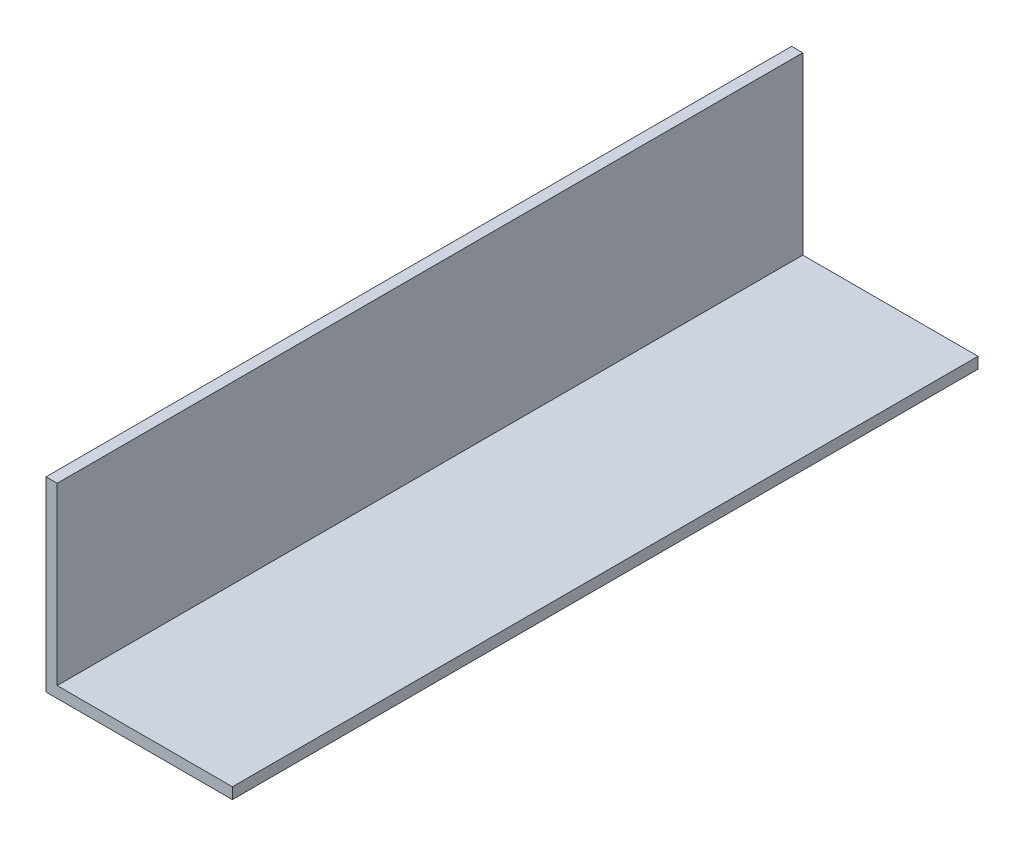
ISO-10303-21;
HEADER;
FILE_DESCRIPTION(('STEP AP214'),'2;1');
FILE_NAME('part.step','',(''),(''),'','','');
FILE_SCHEMA(('AUTOMOTIVE_DESIGN { 1 0 10303 214 1 1 1 1 }'));
ENDSEC;
DATA;
#1=APPLICATION_CONTEXT('core data for automotive mechanical design processes');
#2=APPLICATION_PROTOCOL_DEFINITION('international standard','automotive_design',2000,#1);
#3=PRODUCT_CONTEXT('',#1,'mechanical');
#4=PRODUCT('Part','Part','',(#3));
#5=PRODUCT_RELATED_PRODUCT_CATEGORY('part','',(#4));
#6=PRODUCT_DEFINITION_FORMATION('','',#4);
#7=PRODUCT_DEFINITION_CONTEXT('part definition',#1,'design');
#8=PRODUCT_DEFINITION('design','',#6,#7);
#9=PRODUCT_DEFINITION_SHAPE('','',#8);
#10=(LENGTH_UNIT() NAMED_UNIT(*) SI_UNIT(.MILLI.,.METRE.));
#11=(NAMED_UNIT(*) PLANE_ANGLE_UNIT() SI_UNIT($,.RADIAN.));
#12=(NAMED_UNIT(*) SI_UNIT($,.STERADIAN.) SOLID_ANGLE_UNIT());
#13=UNCERTAINTY_MEASURE_WITH_UNIT(LENGTH_MEASURE(1.E-05),#10,'distance_accuracy_value','');
#14=(GEOMETRIC_REPRESENTATION_CONTEXT(3) GLOBAL_UNCERTAINTY_ASSIGNED_CONTEXT((#13)) GLOBAL_UNIT_ASSIGNED_CONTEXT((#10,
#11,#12)) REPRESENTATION_CONTEXT('',''));
#15=CARTESIAN_POINT('',(0.,0.,0.));
#16=DIRECTION('',(0.,0.,1.));
#17=DIRECTION('',(1.,0.,0.));
#18=AXIS2_PLACEMENT_3D('',#15,#16,#17);
#19=CARTESIAN_POINT('',(25.,0.,100.));
#20=DIRECTION('',(0.,1.,0.));
#21=DIRECTION('',(-1.,0.,0.));
#22=AXIS2_PLACEMENT_3D('',#19,#20,#21);
#23=PLANE('',#22);
#24=DIRECTION('',(1.,0.,0.));
#25=VECTOR('',#24,1.);
#26=CARTESIAN_POINT('',(25.,0.,0.));
#27=LINE('',#26,#25);
#28=CARTESIAN_POINT('',(0.,0.,0.));
#29=VERTEX_POINT('',#28);
#30=CARTESIAN_POINT('',(25.,0.,0.));
#31=VERTEX_POINT('',#30);
#32=EDGE_CURVE('E117',#29,#31,#27,.T.);
#33=ORIENTED_EDGE('',*,*,#32,.T.);
#34=DIRECTION('',(0.,0.,-1.));
#35=VECTOR('',#34,1.);
#36=CARTESIAN_POINT('',(25.,0.,100.));
#37=LINE('',#36,#35);
#38=CARTESIAN_POINT('',(25.,0.,100.));
#39=VERTEX_POINT('',#38);
#40=EDGE_CURVE('E11',#39,#31,#37,.T.);
#41=ORIENTED_EDGE('',*,*,#40,.F.);
#42=DIRECTION('',(1.,0.,0.));
#43=VECTOR('',#42,1.);
#44=CARTESIAN_POINT('',(25.,0.,100.));
#45=LINE('',#44,#43);
#46=CARTESIAN_POINT('',(0.,0.,100.));
#47=VERTEX_POINT('',#46);
#48=EDGE_CURVE('E127',#47,#39,#45,.T.);
#49=ORIENTED_EDGE('',*,*,#48,.F.);
#50=DIRECTION('',(0.,0.,-1.));
#51=VECTOR('',#50,1.);
#52=CARTESIAN_POINT('',(0.,0.,100.));
#53=LINE('',#52,#51);
#54=EDGE_CURVE('E113',#47,#29,#53,.T.);
#55=ORIENTED_EDGE('',*,*,#54,.T.);
#56=EDGE_LOOP('',(#33,#41,#49,#55));
#57=FACE_BOUND('',#56,.T.);
#58=ADVANCED_FACE('F33',(#57),#23,.F.);
#59=CARTESIAN_POINT('',(25.,1.5,100.));
#60=DIRECTION('',(-1.,0.,0.));
#61=DIRECTION('',(0.,0.,1.));
#62=AXIS2_PLACEMENT_3D('',#59,#60,#61);
#63=PLANE('',#62);
#64=DIRECTION('',(0.,1.,0.));
#65=VECTOR('',#64,1.);
#66=CARTESIAN_POINT('',(25.,1.5,0.));
#67=LINE('',#66,#65);
#68=CARTESIAN_POINT('',(25.,1.5,0.));
#69=VERTEX_POINT('',#68);
#70=EDGE_CURVE('E120',#31,#69,#67,.T.);
#71=ORIENTED_EDGE('',*,*,#70,.T.);
#72=DIRECTION('',(0.,0.,-1.));
#73=VECTOR('',#72,1.);
#74=CARTESIAN_POINT('',(25.,1.5,100.));
#75=LINE('',#74,#73);
#76=CARTESIAN_POINT('',(25.,1.5,100.));
#77=VERTEX_POINT('',#76);
#78=EDGE_CURVE('E41',#77,#69,#75,.T.);
#79=ORIENTED_EDGE('',*,*,#78,.F.);
#80=DIRECTION('',(0.,1.,0.));
#81=VECTOR('',#80,1.);
#82=CARTESIAN_POINT('',(25.,1.5,100.));
#83=LINE('',#82,#81);
#84=EDGE_CURVE('E86',#39,#77,#83,.T.);
#85=ORIENTED_EDGE('',*,*,#84,.F.);
#86=ORIENTED_EDGE('',*,*,#40,.T.);
#87=EDGE_LOOP('',(#71,#79,#85,#86));
#88=FACE_BOUND('',#87,.T.);
#89=ADVANCED_FACE('F151',(#88),#63,.F.);
#90=CARTESIAN_POINT('',(1.5,1.5,100.));
#91=DIRECTION('',(0.,-1.,0.));
#92=DIRECTION('',(1.,0.,0.));
#93=AXIS2_PLACEMENT_3D('',#90,#91,#92);
#94=PLANE('',#93);
#95=DIRECTION('',(-1.,0.,0.));
#96=VECTOR('',#95,1.);
#97=CARTESIAN_POINT('',(1.5,1.5,0.));
#98=LINE('',#97,#96);
#99=CARTESIAN_POINT('',(1.5,1.5,0.));
#100=VERTEX_POINT('',#99);
#101=EDGE_CURVE('E122',#69,#100,#98,.T.);
#102=ORIENTED_EDGE('',*,*,#101,.T.);
#103=DIRECTION('',(0.,0.,-1.));
#104=VECTOR('',#103,1.);
#105=CARTESIAN_POINT('',(1.5,1.5,100.));
#106=LINE('',#105,#104);
#107=CARTESIAN_POINT('',(1.5,1.5,100.));
#108=VERTEX_POINT('',#107);
#109=EDGE_CURVE('E108',#108,#100,#106,.T.);
#110=ORIENTED_EDGE('',*,*,#109,.F.);
#111=DIRECTION('',(-1.,0.,0.));
#112=VECTOR('',#111,1.);
#113=CARTESIAN_POINT('',(1.5,1.5,100.));
#114=LINE('',#113,#112);
#115=EDGE_CURVE('E99',#77,#108,#114,.T.);
#116=ORIENTED_EDGE('',*,*,#115,.F.);
#117=ORIENTED_EDGE('',*,*,#78,.T.);
#118=EDGE_LOOP('',(#102,#110,#116,#117));
#119=FACE_BOUND('',#118,.T.);
#120=ADVANCED_FACE('F133',(#119),#94,.F.);
#121=CARTESIAN_POINT('',(1.5,25.,100.));
#122=DIRECTION('',(-1.,0.,0.));
#123=DIRECTION('',(0.,-1.,0.));
#124=AXIS2_PLACEMENT_3D('',#121,#122,#123);
#125=PLANE('',#124);
#126=DIRECTION('',(0.,1.,0.));
#127=VECTOR('',#126,1.);
#128=CARTESIAN_POINT('',(1.5,25.,0.));
#129=LINE('',#128,#127);
#130=CARTESIAN_POINT('',(1.5,25.,0.));
#131=VERTEX_POINT('',#130);
#132=EDGE_CURVE('E107',#100,#131,#129,.T.);
#133=ORIENTED_EDGE('',*,*,#132,.T.);
#134=DIRECTION('',(0.,0.,-1.));
#135=VECTOR('',#134,1.);
#136=CARTESIAN_POINT('',(1.5,25.,100.));
#137=LINE('',#136,#135);
#138=CARTESIAN_POINT('',(1.5,25.,100.));
#139=VERTEX_POINT('',#138);
#140=EDGE_CURVE('E104',#139,#131,#137,.T.);
#141=ORIENTED_EDGE('',*,*,#140,.F.);
#142=DIRECTION('',(0.,1.,0.));
#143=VECTOR('',#142,1.);
#144=CARTESIAN_POINT('',(1.5,25.,100.));
#145=LINE('',#144,#143);
#146=EDGE_CURVE('E93',#108,#139,#145,.T.);
#147=ORIENTED_EDGE('',*,*,#146,.F.);
#148=ORIENTED_EDGE('',*,*,#109,.T.);
#149=EDGE_LOOP('',(#133,#141,#147,#148));
#150=FACE_BOUND('',#149,.T.);
#151=ADVANCED_FACE('F105',(#150),#125,.F.);
#152=CARTESIAN_POINT('',(0.,25.,100.));
#153=DIRECTION('',(0.,-1.,0.));
#154=DIRECTION('',(0.,0.,-1.));
#155=AXIS2_PLACEMENT_3D('',#152,#153,#154);
#156=PLANE('',#155);
#157=DIRECTION('',(-1.,0.,0.));
#158=VECTOR('',#157,1.);
#159=CARTESIAN_POINT('',(0.,25.,0.));
#160=LINE('',#159,#158);
#161=CARTESIAN_POINT('',(0.,25.,0.));
#162=VERTEX_POINT('',#161);
#163=EDGE_CURVE('E72',#131,#162,#160,.T.);
#164=ORIENTED_EDGE('',*,*,#163,.T.);
#165=DIRECTION('',(0.,0.,-1.));
#166=VECTOR('',#165,1.);
#167=CARTESIAN_POINT('',(0.,25.,100.));
#168=LINE('',#167,#166);
#169=CARTESIAN_POINT('',(0.,25.,100.));
#170=VERTEX_POINT('',#169);
#171=EDGE_CURVE('E109',#170,#162,#168,.T.);
#172=ORIENTED_EDGE('',*,*,#171,.F.);
#173=DIRECTION('',(-1.,0.,0.));
#174=VECTOR('',#173,1.);
#175=CARTESIAN_POINT('',(0.,25.,100.));
#176=LINE('',#175,#174);
#177=EDGE_CURVE('E97',#139,#170,#176,.T.);
#178=ORIENTED_EDGE('',*,*,#177,.F.);
#179=ORIENTED_EDGE('',*,*,#140,.T.);
#180=EDGE_LOOP('',(#164,#172,#178,#179));
#181=FACE_BOUND('',#180,.T.);
#182=ADVANCED_FACE('F111',(#181),#156,.F.);
#183=CARTESIAN_POINT('',(0.,0.,100.));
#184=DIRECTION('',(1.,0.,0.));
#185=DIRECTION('',(0.,0.,-1.));
#186=AXIS2_PLACEMENT_3D('',#183,#184,#185);
#187=PLANE('',#186);
#188=DIRECTION('',(0.,-1.,0.));
#189=VECTOR('',#188,1.);
#190=CARTESIAN_POINT('',(0.,0.,0.));
#191=LINE('',#190,#189);
#192=EDGE_CURVE('E78',#162,#29,#191,.T.);
#193=ORIENTED_EDGE('',*,*,#192,.T.);
#194=ORIENTED_EDGE('',*,*,#54,.F.);
#195=DIRECTION('',(0.,-1.,0.));
#196=VECTOR('',#195,1.);
#197=CARTESIAN_POINT('',(0.,0.,100.));
#198=LINE('',#197,#196);
#199=EDGE_CURVE('E49',#170,#47,#198,.T.);
#200=ORIENTED_EDGE('',*,*,#199,.F.);
#201=ORIENTED_EDGE('',*,*,#171,.T.);
#202=EDGE_LOOP('',(#193,#194,#200,#201));
#203=FACE_BOUND('',#202,.T.);
#204=ADVANCED_FACE('F140',(#203),#187,.F.);
#205=CARTESIAN_POINT('',(0.,0.,100.));
#206=DIRECTION('',(0.,0.,-1.));
#207=DIRECTION('',(-1.,0.,0.));
#208=AXIS2_PLACEMENT_3D('',#205,#206,#207);
#209=PLANE('',#208);
#210=ORIENTED_EDGE('',*,*,#48,.T.);
#211=ORIENTED_EDGE('',*,*,#84,.T.);
#212=ORIENTED_EDGE('',*,*,#115,.T.);
#213=ORIENTED_EDGE('',*,*,#146,.T.);
#214=ORIENTED_EDGE('',*,*,#177,.T.);
#215=ORIENTED_EDGE('',*,*,#199,.T.);
#216=EDGE_LOOP('',(#210,#211,#212,#213,#214,#215));
#217=FACE_BOUND('',#216,.T.);
#218=ADVANCED_FACE('F95',(#217),#209,.F.);
#219=CARTESIAN_POINT('',(0.,0.,0.));
#220=DIRECTION('',(0.,0.,-1.));
#221=DIRECTION('',(-1.,0.,0.));
#222=AXIS2_PLACEMENT_3D('',#219,#220,#221);
#223=PLANE('',#222);
#224=ORIENTED_EDGE('',*,*,#32,.F.);
#225=ORIENTED_EDGE('',*,*,#192,.F.);
#226=ORIENTED_EDGE('',*,*,#163,.F.);
#227=ORIENTED_EDGE('',*,*,#132,.F.);
#228=ORIENTED_EDGE('',*,*,#101,.F.);
#229=ORIENTED_EDGE('',*,*,#70,.F.);
#230=EDGE_LOOP('',(#224,#225,#226,#227,#228,#229));
#231=FACE_BOUND('',#230,.T.);
#232=ADVANCED_FACE('F136',(#231),#223,.T.);
#233=CLOSED_SHELL('',(#58,#89,#120,#151,#182,#204,#218,#232));
#234=MANIFOLD_SOLID_BREP('B2',#233);
#235=ADVANCED_BREP_SHAPE_REPRESENTATION('',(#18,#234),#14);
#236=SHAPE_DEFINITION_REPRESENTATION(#9,#235);
ENDSEC;
END-ISO-10303-21;
